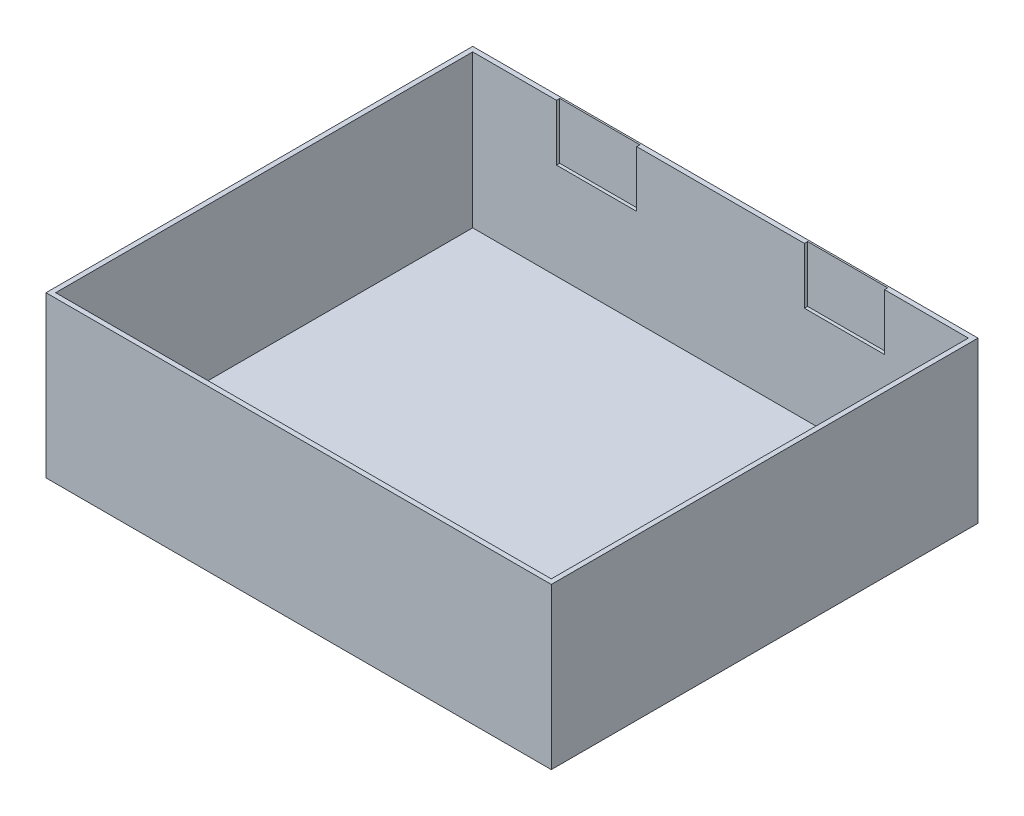
ISO-10303-21;
HEADER;
FILE_DESCRIPTION(('STEP AP214'),'2;1');
FILE_NAME('part.step','',(''),(''),'','','');
FILE_SCHEMA(('AUTOMOTIVE_DESIGN { 1 0 10303 214 1 1 1 1 }'));
ENDSEC;
DATA;
#1=APPLICATION_CONTEXT('core data for automotive mechanical design processes');
#2=APPLICATION_PROTOCOL_DEFINITION('international standard','automotive_design',2000,#1);
#3=PRODUCT_CONTEXT('',#1,'mechanical');
#4=PRODUCT('Part','Part','',(#3));
#5=PRODUCT_RELATED_PRODUCT_CATEGORY('part','',(#4));
#6=PRODUCT_DEFINITION_FORMATION('','',#4);
#7=PRODUCT_DEFINITION_CONTEXT('part definition',#1,'design');
#8=PRODUCT_DEFINITION('design','',#6,#7);
#9=PRODUCT_DEFINITION_SHAPE('','',#8);
#10=(LENGTH_UNIT() NAMED_UNIT(*) SI_UNIT(.MILLI.,.METRE.));
#11=(NAMED_UNIT(*) PLANE_ANGLE_UNIT() SI_UNIT($,.RADIAN.));
#12=(NAMED_UNIT(*) SI_UNIT($,.STERADIAN.) SOLID_ANGLE_UNIT());
#13=UNCERTAINTY_MEASURE_WITH_UNIT(LENGTH_MEASURE(1.E-05),#10,'distance_accuracy_value','');
#14=(GEOMETRIC_REPRESENTATION_CONTEXT(3) GLOBAL_UNCERTAINTY_ASSIGNED_CONTEXT((#13)) GLOBAL_UNIT_ASSIGNED_CONTEXT((#10,
#11,#12)) REPRESENTATION_CONTEXT('',''));
#15=CARTESIAN_POINT('',(0.,0.,0.));
#16=DIRECTION('',(0.,0.,1.));
#17=DIRECTION('',(1.,0.,0.));
#18=AXIS2_PLACEMENT_3D('',#15,#16,#17);
#19=CARTESIAN_POINT('',(0.,100.,0.));
#20=DIRECTION('',(0.,-1.,0.));
#21=DIRECTION('',(0.,0.,-1.));
#22=AXIS2_PLACEMENT_3D('',#19,#20,#21);
#23=PLANE('',#22);
#24=DIRECTION('',(0.,0.,-1.));
#25=VECTOR('',#24,1.);
#26=CARTESIAN_POINT('',(157.5,100.,133.));
#27=LINE('',#26,#25);
#28=CARTESIAN_POINT('',(157.5,100.,133.));
#29=VERTEX_POINT('',#28);
#30=CARTESIAN_POINT('',(157.5,100.,-133.));
#31=VERTEX_POINT('',#30);
#32=EDGE_CURVE('E232',#29,#31,#27,.T.);
#33=ORIENTED_EDGE('',*,*,#32,.T.);
#34=DIRECTION('',(-1.,0.,0.));
#35=VECTOR('',#34,1.);
#36=CARTESIAN_POINT('',(-157.5,100.,-133.));
#37=LINE('',#36,#35);
#38=CARTESIAN_POINT('',(-157.5,100.,-133.));
#39=VERTEX_POINT('',#38);
#40=EDGE_CURVE('E235',#31,#39,#37,.T.);
#41=ORIENTED_EDGE('',*,*,#40,.T.);
#42=DIRECTION('',(0.,0.,1.));
#43=VECTOR('',#42,1.);
#44=CARTESIAN_POINT('',(-157.5,100.,133.));
#45=LINE('',#44,#43);
#46=CARTESIAN_POINT('',(-157.5,100.,133.));
#47=VERTEX_POINT('',#46);
#48=EDGE_CURVE('E238',#39,#47,#45,.T.);
#49=ORIENTED_EDGE('',*,*,#48,.T.);
#50=DIRECTION('',(1.,0.,0.));
#51=VECTOR('',#50,1.);
#52=CARTESIAN_POINT('',(-157.5,100.,133.));
#53=LINE('',#52,#51);
#54=EDGE_CURVE('E240',#47,#29,#53,.T.);
#55=ORIENTED_EDGE('',*,*,#54,.T.);
#56=EDGE_LOOP('',(#33,#41,#49,#55));
#57=FACE_BOUND('',#56,.T.);
#58=DIRECTION('',(0.,0.,1.));
#59=VECTOR('',#58,1.);
#60=CARTESIAN_POINT('',(102.25,100.,-132.));
#61=LINE('',#60,#59);
#62=CARTESIAN_POINT('',(102.25,100.,-132.));
#63=VERTEX_POINT('',#62);
#64=CARTESIAN_POINT('',(102.25,100.,-130.));
#65=VERTEX_POINT('',#64);
#66=EDGE_CURVE('E153',#63,#65,#61,.T.);
#67=ORIENTED_EDGE('',*,*,#66,.T.);
#68=DIRECTION('',(-1.,0.,0.));
#69=VECTOR('',#68,1.);
#70=CARTESIAN_POINT('',(-154.5,100.,-130.));
#71=LINE('',#70,#69);
#72=CARTESIAN_POINT('',(154.5,100.,-130.));
#73=VERTEX_POINT('',#72);
#74=EDGE_CURVE('E222',#73,#65,#71,.T.);
#75=ORIENTED_EDGE('',*,*,#74,.F.);
#76=DIRECTION('',(0.,0.,-1.));
#77=VECTOR('',#76,1.);
#78=CARTESIAN_POINT('',(154.5,100.,-130.));
#79=LINE('',#78,#77);
#80=CARTESIAN_POINT('',(154.5,100.,130.));
#81=VERTEX_POINT('',#80);
#82=EDGE_CURVE('E212',#81,#73,#79,.T.);
#83=ORIENTED_EDGE('',*,*,#82,.F.);
#84=DIRECTION('',(1.,0.,0.));
#85=VECTOR('',#84,1.);
#86=CARTESIAN_POINT('',(-154.5,100.,130.));
#87=LINE('',#86,#85);
#88=CARTESIAN_POINT('',(-154.5,100.,130.));
#89=VERTEX_POINT('',#88);
#90=EDGE_CURVE('E228',#89,#81,#87,.T.);
#91=ORIENTED_EDGE('',*,*,#90,.F.);
#92=DIRECTION('',(0.,0.,1.));
#93=VECTOR('',#92,1.);
#94=CARTESIAN_POINT('',(-154.5,100.,-130.));
#95=LINE('',#94,#93);
#96=CARTESIAN_POINT('',(-154.5,100.,-130.));
#97=VERTEX_POINT('',#96);
#98=EDGE_CURVE('E224',#97,#89,#95,.T.);
#99=ORIENTED_EDGE('',*,*,#98,.F.);
#100=CARTESIAN_POINT('',(-102.25,100.,-130.));
#101=VERTEX_POINT('',#100);
#102=EDGE_CURVE('E221',#101,#97,#71,.T.);
#103=ORIENTED_EDGE('',*,*,#102,.F.);
#104=DIRECTION('',(0.,0.,1.));
#105=VECTOR('',#104,1.);
#106=CARTESIAN_POINT('',(-102.25,100.,-132.));
#107=LINE('',#106,#105);
#108=CARTESIAN_POINT('',(-102.25,100.,-132.));
#109=VERTEX_POINT('',#108);
#110=EDGE_CURVE('E210',#109,#101,#107,.T.);
#111=ORIENTED_EDGE('',*,*,#110,.F.);
#112=DIRECTION('',(-1.,0.,0.));
#113=VECTOR('',#112,1.);
#114=CARTESIAN_POINT('',(-102.25,100.,-132.));
#115=LINE('',#114,#113);
#116=CARTESIAN_POINT('',(-52.25,100.,-132.));
#117=VERTEX_POINT('',#116);
#118=EDGE_CURVE('E200',#117,#109,#115,.T.);
#119=ORIENTED_EDGE('',*,*,#118,.F.);
#120=DIRECTION('',(0.,0.,1.));
#121=VECTOR('',#120,1.);
#122=CARTESIAN_POINT('',(-52.25,100.,-132.));
#123=LINE('',#122,#121);
#124=CARTESIAN_POINT('',(-52.25,100.,-130.));
#125=VERTEX_POINT('',#124);
#126=EDGE_CURVE('E213',#117,#125,#123,.T.);
#127=ORIENTED_EDGE('',*,*,#126,.T.);
#128=CARTESIAN_POINT('',(52.25,100.,-130.));
#129=VERTEX_POINT('',#128);
#130=EDGE_CURVE('E225',#129,#125,#71,.T.);
#131=ORIENTED_EDGE('',*,*,#130,.F.);
#132=DIRECTION('',(0.,0.,1.));
#133=VECTOR('',#132,1.);
#134=CARTESIAN_POINT('',(52.25,100.,-132.));
#135=LINE('',#134,#133);
#136=CARTESIAN_POINT('',(52.25,100.,-132.));
#137=VERTEX_POINT('',#136);
#138=EDGE_CURVE('E54',#137,#129,#135,.T.);
#139=ORIENTED_EDGE('',*,*,#138,.F.);
#140=DIRECTION('',(1.,0.,0.));
#141=VECTOR('',#140,1.);
#142=CARTESIAN_POINT('',(102.25,100.,-132.));
#143=LINE('',#142,#141);
#144=EDGE_CURVE('E171',#137,#63,#143,.T.);
#145=ORIENTED_EDGE('',*,*,#144,.T.);
#146=EDGE_LOOP('',(#67,#75,#83,#91,#99,#103,#111,#119,#127,#131,#139,#145));
#147=FACE_BOUND('',#146,.T.);
#148=ADVANCED_FACE('F37',(#57,#147),#23,.F.);
#149=CARTESIAN_POINT('',(-157.5,100.,-130.));
#150=DIRECTION('',(0.,0.,1.));
#151=DIRECTION('',(1.,0.,0.));
#152=AXIS2_PLACEMENT_3D('',#149,#150,#151);
#153=PLANE('',#152);
#154=ORIENTED_EDGE('',*,*,#74,.T.);
#155=DIRECTION('',(0.,-1.,0.));
#156=VECTOR('',#155,1.);
#157=CARTESIAN_POINT('',(102.25,100.,-130.));
#158=LINE('',#157,#156);
#159=CARTESIAN_POINT('',(102.25,65.,-130.));
#160=VERTEX_POINT('',#159);
#161=EDGE_CURVE('E160',#65,#160,#158,.T.);
#162=ORIENTED_EDGE('',*,*,#161,.T.);
#163=DIRECTION('',(-1.,0.,0.));
#164=VECTOR('',#163,1.);
#165=CARTESIAN_POINT('',(102.25,65.,-130.));
#166=LINE('',#165,#164);
#167=CARTESIAN_POINT('',(52.25,65.,-130.));
#168=VERTEX_POINT('',#167);
#169=EDGE_CURVE('E172',#160,#168,#166,.T.);
#170=ORIENTED_EDGE('',*,*,#169,.T.);
#171=DIRECTION('',(0.,1.,0.));
#172=VECTOR('',#171,1.);
#173=CARTESIAN_POINT('',(52.25,100.,-130.));
#174=LINE('',#173,#172);
#175=EDGE_CURVE('E181',#168,#129,#174,.T.);
#176=ORIENTED_EDGE('',*,*,#175,.T.);
#177=ORIENTED_EDGE('',*,*,#130,.T.);
#178=DIRECTION('',(0.,1.,0.));
#179=VECTOR('',#178,1.);
#180=CARTESIAN_POINT('',(-52.25,100.,-130.));
#181=LINE('',#180,#179);
#182=CARTESIAN_POINT('',(-52.25,65.,-130.));
#183=VERTEX_POINT('',#182);
#184=EDGE_CURVE('E194',#183,#125,#181,.T.);
#185=ORIENTED_EDGE('',*,*,#184,.F.);
#186=DIRECTION('',(1.,0.,0.));
#187=VECTOR('',#186,1.);
#188=CARTESIAN_POINT('',(-102.25,65.,-130.));
#189=LINE('',#188,#187);
#190=CARTESIAN_POINT('',(-102.25,65.,-130.));
#191=VERTEX_POINT('',#190);
#192=EDGE_CURVE('E205',#191,#183,#189,.T.);
#193=ORIENTED_EDGE('',*,*,#192,.F.);
#194=DIRECTION('',(0.,-1.,0.));
#195=VECTOR('',#194,1.);
#196=CARTESIAN_POINT('',(-102.25,100.,-130.));
#197=LINE('',#196,#195);
#198=EDGE_CURVE('E62',#101,#191,#197,.T.);
#199=ORIENTED_EDGE('',*,*,#198,.F.);
#200=ORIENTED_EDGE('',*,*,#102,.T.);
#201=DIRECTION('',(0.,-1.,0.));
#202=VECTOR('',#201,1.);
#203=CARTESIAN_POINT('',(-154.5,100.,-130.));
#204=LINE('',#203,#202);
#205=CARTESIAN_POINT('',(-154.5,5.,-130.));
#206=VERTEX_POINT('',#205);
#207=EDGE_CURVE('E262',#97,#206,#204,.T.);
#208=ORIENTED_EDGE('',*,*,#207,.T.);
#209=DIRECTION('',(-1.,0.,0.));
#210=VECTOR('',#209,1.);
#211=CARTESIAN_POINT('',(0.,5.,-130.));
#212=LINE('',#211,#210);
#213=CARTESIAN_POINT('',(154.5,5.,-130.));
#214=VERTEX_POINT('',#213);
#215=EDGE_CURVE('E270',#214,#206,#212,.T.);
#216=ORIENTED_EDGE('',*,*,#215,.F.);
#217=DIRECTION('',(0.,-1.,0.));
#218=VECTOR('',#217,1.);
#219=CARTESIAN_POINT('',(154.5,100.,-130.));
#220=LINE('',#219,#218);
#221=EDGE_CURVE('E267',#73,#214,#220,.T.);
#222=ORIENTED_EDGE('',*,*,#221,.F.);
#223=EDGE_LOOP('',(#154,#162,#170,#176,#177,#185,#193,#199,#200,#208,#216,#222));
#224=FACE_BOUND('',#223,.T.);
#225=ADVANCED_FACE('F282',(#224),#153,.T.);
#226=CARTESIAN_POINT('',(157.5,100.,133.));
#227=DIRECTION('',(-1.,0.,0.));
#228=DIRECTION('',(0.,0.,1.));
#229=AXIS2_PLACEMENT_3D('',#226,#227,#228);
#230=PLANE('',#229);
#231=DIRECTION('',(0.,0.,-1.));
#232=VECTOR('',#231,1.);
#233=CARTESIAN_POINT('',(157.5,0.,133.));
#234=LINE('',#233,#232);
#235=CARTESIAN_POINT('',(157.5,0.,133.));
#236=VERTEX_POINT('',#235);
#237=CARTESIAN_POINT('',(157.5,0.,-133.));
#238=VERTEX_POINT('',#237);
#239=EDGE_CURVE('E231',#236,#238,#234,.T.);
#240=ORIENTED_EDGE('',*,*,#239,.T.);
#241=DIRECTION('',(0.,-1.,0.));
#242=VECTOR('',#241,1.);
#243=CARTESIAN_POINT('',(157.5,100.,-133.));
#244=LINE('',#243,#242);
#245=EDGE_CURVE('E258',#31,#238,#244,.T.);
#246=ORIENTED_EDGE('',*,*,#245,.F.);
#247=ORIENTED_EDGE('',*,*,#32,.F.);
#248=DIRECTION('',(0.,-1.,0.));
#249=VECTOR('',#248,1.);
#250=CARTESIAN_POINT('',(157.5,100.,133.));
#251=LINE('',#250,#249);
#252=EDGE_CURVE('E242',#29,#236,#251,.T.);
#253=ORIENTED_EDGE('',*,*,#252,.T.);
#254=EDGE_LOOP('',(#240,#246,#247,#253));
#255=FACE_BOUND('',#254,.T.);
#256=ADVANCED_FACE('F304',(#255),#230,.F.);
#257=CARTESIAN_POINT('',(-157.5,100.,-133.));
#258=DIRECTION('',(0.,0.,1.));
#259=DIRECTION('',(1.,0.,0.));
#260=AXIS2_PLACEMENT_3D('',#257,#258,#259);
#261=PLANE('',#260);
#262=DIRECTION('',(-1.,0.,0.));
#263=VECTOR('',#262,1.);
#264=CARTESIAN_POINT('',(-157.5,0.,-133.));
#265=LINE('',#264,#263);
#266=CARTESIAN_POINT('',(-157.5,0.,-133.));
#267=VERTEX_POINT('',#266);
#268=EDGE_CURVE('E245',#238,#267,#265,.T.);
#269=ORIENTED_EDGE('',*,*,#268,.T.);
#270=DIRECTION('',(0.,-1.,0.));
#271=VECTOR('',#270,1.);
#272=CARTESIAN_POINT('',(-157.5,100.,-133.));
#273=LINE('',#272,#271);
#274=EDGE_CURVE('E255',#39,#267,#273,.T.);
#275=ORIENTED_EDGE('',*,*,#274,.F.);
#276=ORIENTED_EDGE('',*,*,#40,.F.);
#277=ORIENTED_EDGE('',*,*,#245,.T.);
#278=EDGE_LOOP('',(#269,#275,#276,#277));
#279=FACE_BOUND('',#278,.T.);
#280=ADVANCED_FACE('F320',(#279),#261,.F.);
#281=CARTESIAN_POINT('',(-157.5,100.,133.));
#282=DIRECTION('',(1.,0.,0.));
#283=DIRECTION('',(0.,0.,-1.));
#284=AXIS2_PLACEMENT_3D('',#281,#282,#283);
#285=PLANE('',#284);
#286=DIRECTION('',(0.,0.,1.));
#287=VECTOR('',#286,1.);
#288=CARTESIAN_POINT('',(-157.5,0.,133.));
#289=LINE('',#288,#287);
#290=CARTESIAN_POINT('',(-157.5,0.,133.));
#291=VERTEX_POINT('',#290);
#292=EDGE_CURVE('E247',#267,#291,#289,.T.);
#293=ORIENTED_EDGE('',*,*,#292,.T.);
#294=DIRECTION('',(0.,-1.,0.));
#295=VECTOR('',#294,1.);
#296=CARTESIAN_POINT('',(-157.5,100.,133.));
#297=LINE('',#296,#295);
#298=EDGE_CURVE('E252',#47,#291,#297,.T.);
#299=ORIENTED_EDGE('',*,*,#298,.F.);
#300=ORIENTED_EDGE('',*,*,#48,.F.);
#301=ORIENTED_EDGE('',*,*,#274,.T.);
#302=EDGE_LOOP('',(#293,#299,#300,#301));
#303=FACE_BOUND('',#302,.T.);
#304=ADVANCED_FACE('F316',(#303),#285,.F.);
#305=CARTESIAN_POINT('',(-157.5,100.,133.));
#306=DIRECTION('',(0.,0.,-1.));
#307=DIRECTION('',(-1.,0.,0.));
#308=AXIS2_PLACEMENT_3D('',#305,#306,#307);
#309=PLANE('',#308);
#310=DIRECTION('',(1.,0.,0.));
#311=VECTOR('',#310,1.);
#312=CARTESIAN_POINT('',(-157.5,0.,133.));
#313=LINE('',#312,#311);
#314=EDGE_CURVE('E236',#291,#236,#313,.T.);
#315=ORIENTED_EDGE('',*,*,#314,.T.);
#316=ORIENTED_EDGE('',*,*,#252,.F.);
#317=ORIENTED_EDGE('',*,*,#54,.F.);
#318=ORIENTED_EDGE('',*,*,#298,.T.);
#319=EDGE_LOOP('',(#315,#316,#317,#318));
#320=FACE_BOUND('',#319,.T.);
#321=ADVANCED_FACE('F312',(#320),#309,.F.);
#322=CARTESIAN_POINT('',(0.,0.,0.));
#323=DIRECTION('',(0.,-1.,0.));
#324=DIRECTION('',(0.,0.,-1.));
#325=AXIS2_PLACEMENT_3D('',#322,#323,#324);
#326=PLANE('',#325);
#327=ORIENTED_EDGE('',*,*,#239,.F.);
#328=ORIENTED_EDGE('',*,*,#314,.F.);
#329=ORIENTED_EDGE('',*,*,#292,.F.);
#330=ORIENTED_EDGE('',*,*,#268,.F.);
#331=EDGE_LOOP('',(#327,#328,#329,#330));
#332=FACE_BOUND('',#331,.T.);
#333=ADVANCED_FACE('F309',(#332),#326,.T.);
#334=CARTESIAN_POINT('',(154.5,100.,133.));
#335=DIRECTION('',(-1.,0.,0.));
#336=DIRECTION('',(0.,0.,1.));
#337=AXIS2_PLACEMENT_3D('',#334,#335,#336);
#338=PLANE('',#337);
#339=DIRECTION('',(0.,0.,-1.));
#340=VECTOR('',#339,1.);
#341=CARTESIAN_POINT('',(154.5,5.,0.));
#342=LINE('',#341,#340);
#343=CARTESIAN_POINT('',(154.5,5.,130.));
#344=VERTEX_POINT('',#343);
#345=EDGE_CURVE('E41',#344,#214,#342,.T.);
#346=ORIENTED_EDGE('',*,*,#345,.F.);
#347=DIRECTION('',(0.,-1.,0.));
#348=VECTOR('',#347,1.);
#349=CARTESIAN_POINT('',(154.5,100.,130.));
#350=LINE('',#349,#348);
#351=EDGE_CURVE('E271',#81,#344,#350,.T.);
#352=ORIENTED_EDGE('',*,*,#351,.F.);
#353=ORIENTED_EDGE('',*,*,#82,.T.);
#354=ORIENTED_EDGE('',*,*,#221,.T.);
#355=EDGE_LOOP('',(#346,#352,#353,#354));
#356=FACE_BOUND('',#355,.T.);
#357=ADVANCED_FACE('F279',(#356),#338,.T.);
#358=CARTESIAN_POINT('',(-154.5,100.,133.));
#359=DIRECTION('',(1.,0.,0.));
#360=DIRECTION('',(0.,0.,-1.));
#361=AXIS2_PLACEMENT_3D('',#358,#359,#360);
#362=PLANE('',#361);
#363=DIRECTION('',(0.,0.,1.));
#364=VECTOR('',#363,1.);
#365=CARTESIAN_POINT('',(-154.5,5.,0.));
#366=LINE('',#365,#364);
#367=CARTESIAN_POINT('',(-154.5,5.,130.));
#368=VERTEX_POINT('',#367);
#369=EDGE_CURVE('E265',#206,#368,#366,.T.);
#370=ORIENTED_EDGE('',*,*,#369,.F.);
#371=ORIENTED_EDGE('',*,*,#207,.F.);
#372=ORIENTED_EDGE('',*,*,#98,.T.);
#373=DIRECTION('',(0.,-1.,0.));
#374=VECTOR('',#373,1.);
#375=CARTESIAN_POINT('',(-154.5,100.,130.));
#376=LINE('',#375,#374);
#377=EDGE_CURVE('E11',#89,#368,#376,.T.);
#378=ORIENTED_EDGE('',*,*,#377,.T.);
#379=EDGE_LOOP('',(#370,#371,#372,#378));
#380=FACE_BOUND('',#379,.T.);
#381=ADVANCED_FACE('F288',(#380),#362,.T.);
#382=CARTESIAN_POINT('',(-157.5,100.,130.));
#383=DIRECTION('',(0.,0.,-1.));
#384=DIRECTION('',(-1.,0.,0.));
#385=AXIS2_PLACEMENT_3D('',#382,#383,#384);
#386=PLANE('',#385);
#387=DIRECTION('',(1.,0.,0.));
#388=VECTOR('',#387,1.);
#389=CARTESIAN_POINT('',(0.,5.,130.));
#390=LINE('',#389,#388);
#391=EDGE_CURVE('E46',#368,#344,#390,.T.);
#392=ORIENTED_EDGE('',*,*,#391,.F.);
#393=ORIENTED_EDGE('',*,*,#377,.F.);
#394=ORIENTED_EDGE('',*,*,#90,.T.);
#395=ORIENTED_EDGE('',*,*,#351,.T.);
#396=EDGE_LOOP('',(#392,#393,#394,#395));
#397=FACE_BOUND('',#396,.T.);
#398=ADVANCED_FACE('F290',(#397),#386,.T.);
#399=CARTESIAN_POINT('',(0.,5.,0.));
#400=DIRECTION('',(0.,-1.,0.));
#401=DIRECTION('',(0.,0.,-1.));
#402=AXIS2_PLACEMENT_3D('',#399,#400,#401);
#403=PLANE('',#402);
#404=ORIENTED_EDGE('',*,*,#345,.T.);
#405=ORIENTED_EDGE('',*,*,#215,.T.);
#406=ORIENTED_EDGE('',*,*,#369,.T.);
#407=ORIENTED_EDGE('',*,*,#391,.T.);
#408=EDGE_LOOP('',(#404,#405,#406,#407));
#409=FACE_BOUND('',#408,.T.);
#410=ADVANCED_FACE('F39',(#409),#403,.F.);
#411=CARTESIAN_POINT('',(-102.25,100.,-132.));
#412=DIRECTION('',(-1.,0.,0.));
#413=DIRECTION('',(0.,0.,1.));
#414=AXIS2_PLACEMENT_3D('',#411,#412,#413);
#415=PLANE('',#414);
#416=ORIENTED_EDGE('',*,*,#198,.T.);
#417=DIRECTION('',(0.,0.,1.));
#418=VECTOR('',#417,1.);
#419=CARTESIAN_POINT('',(-102.25,65.,-132.));
#420=LINE('',#419,#418);
#421=CARTESIAN_POINT('',(-102.25,65.,-132.));
#422=VERTEX_POINT('',#421);
#423=EDGE_CURVE('E203',#422,#191,#420,.T.);
#424=ORIENTED_EDGE('',*,*,#423,.F.);
#425=DIRECTION('',(0.,-1.,0.));
#426=VECTOR('',#425,1.);
#427=CARTESIAN_POINT('',(-102.25,100.,-132.));
#428=LINE('',#427,#426);
#429=EDGE_CURVE('E190',#109,#422,#428,.T.);
#430=ORIENTED_EDGE('',*,*,#429,.F.);
#431=ORIENTED_EDGE('',*,*,#110,.T.);
#432=EDGE_LOOP('',(#416,#424,#430,#431));
#433=FACE_BOUND('',#432,.T.);
#434=ADVANCED_FACE('F296',(#433),#415,.F.);
#435=CARTESIAN_POINT('',(-52.25,100.,-132.));
#436=DIRECTION('',(1.,0.,0.));
#437=DIRECTION('',(0.,1.,0.));
#438=AXIS2_PLACEMENT_3D('',#435,#436,#437);
#439=PLANE('',#438);
#440=ORIENTED_EDGE('',*,*,#184,.T.);
#441=ORIENTED_EDGE('',*,*,#126,.F.);
#442=DIRECTION('',(0.,1.,0.));
#443=VECTOR('',#442,1.);
#444=CARTESIAN_POINT('',(-52.25,100.,-132.));
#445=LINE('',#444,#443);
#446=CARTESIAN_POINT('',(-52.25,65.,-132.));
#447=VERTEX_POINT('',#446);
#448=EDGE_CURVE('E197',#447,#117,#445,.T.);
#449=ORIENTED_EDGE('',*,*,#448,.F.);
#450=DIRECTION('',(0.,0.,1.));
#451=VECTOR('',#450,1.);
#452=CARTESIAN_POINT('',(-52.25,65.,-132.));
#453=LINE('',#452,#451);
#454=EDGE_CURVE('E216',#447,#183,#453,.T.);
#455=ORIENTED_EDGE('',*,*,#454,.T.);
#456=EDGE_LOOP('',(#440,#441,#449,#455));
#457=FACE_BOUND('',#456,.T.);
#458=ADVANCED_FACE('F353',(#457),#439,.F.);
#459=CARTESIAN_POINT('',(-102.25,65.,-132.));
#460=DIRECTION('',(0.,-1.,0.));
#461=DIRECTION('',(1.,0.,0.));
#462=AXIS2_PLACEMENT_3D('',#459,#460,#461);
#463=PLANE('',#462);
#464=ORIENTED_EDGE('',*,*,#192,.T.);
#465=ORIENTED_EDGE('',*,*,#454,.F.);
#466=DIRECTION('',(1.,0.,0.));
#467=VECTOR('',#466,1.);
#468=CARTESIAN_POINT('',(-102.25,65.,-132.));
#469=LINE('',#468,#467);
#470=EDGE_CURVE('E193',#422,#447,#469,.T.);
#471=ORIENTED_EDGE('',*,*,#470,.F.);
#472=ORIENTED_EDGE('',*,*,#423,.T.);
#473=EDGE_LOOP('',(#464,#465,#471,#472));
#474=FACE_BOUND('',#473,.T.);
#475=ADVANCED_FACE('F361',(#474),#463,.F.);
#476=CARTESIAN_POINT('',(0.,0.,-132.));
#477=DIRECTION('',(0.,0.,1.));
#478=DIRECTION('',(1.,0.,0.));
#479=AXIS2_PLACEMENT_3D('',#476,#477,#478);
#480=PLANE('',#479);
#481=ORIENTED_EDGE('',*,*,#429,.T.);
#482=ORIENTED_EDGE('',*,*,#470,.T.);
#483=ORIENTED_EDGE('',*,*,#448,.T.);
#484=ORIENTED_EDGE('',*,*,#118,.T.);
#485=EDGE_LOOP('',(#481,#482,#483,#484));
#486=FACE_BOUND('',#485,.T.);
#487=ADVANCED_FACE('F371',(#486),#480,.T.);
#488=CARTESIAN_POINT('',(102.25,100.,-132.));
#489=DIRECTION('',(-1.,0.,0.));
#490=DIRECTION('',(0.,0.,1.));
#491=AXIS2_PLACEMENT_3D('',#488,#489,#490);
#492=PLANE('',#491);
#493=ORIENTED_EDGE('',*,*,#161,.F.);
#494=ORIENTED_EDGE('',*,*,#66,.F.);
#495=DIRECTION('',(0.,-1.,0.));
#496=VECTOR('',#495,1.);
#497=CARTESIAN_POINT('',(102.25,100.,-132.));
#498=LINE('',#497,#496);
#499=CARTESIAN_POINT('',(102.25,65.,-132.));
#500=VERTEX_POINT('',#499);
#501=EDGE_CURVE('E157',#63,#500,#498,.T.);
#502=ORIENTED_EDGE('',*,*,#501,.T.);
#503=DIRECTION('',(0.,0.,1.));
#504=VECTOR('',#503,1.);
#505=CARTESIAN_POINT('',(102.25,65.,-132.));
#506=LINE('',#505,#504);
#507=EDGE_CURVE('E185',#500,#160,#506,.T.);
#508=ORIENTED_EDGE('',*,*,#507,.T.);
#509=EDGE_LOOP('',(#493,#494,#502,#508));
#510=FACE_BOUND('',#509,.T.);
#511=ADVANCED_FACE('F155',(#510),#492,.T.);
#512=CARTESIAN_POINT('',(102.25,65.,-132.));
#513=DIRECTION('',(0.,1.,0.));
#514=DIRECTION('',(-1.,0.,0.));
#515=AXIS2_PLACEMENT_3D('',#512,#513,#514);
#516=PLANE('',#515);
#517=ORIENTED_EDGE('',*,*,#169,.F.);
#518=ORIENTED_EDGE('',*,*,#507,.F.);
#519=DIRECTION('',(-1.,0.,0.));
#520=VECTOR('',#519,1.);
#521=CARTESIAN_POINT('',(102.25,65.,-132.));
#522=LINE('',#521,#520);
#523=CARTESIAN_POINT('',(52.25,65.,-132.));
#524=VERTEX_POINT('',#523);
#525=EDGE_CURVE('E165',#500,#524,#522,.T.);
#526=ORIENTED_EDGE('',*,*,#525,.T.);
#527=DIRECTION('',(0.,0.,1.));
#528=VECTOR('',#527,1.);
#529=CARTESIAN_POINT('',(52.25,65.,-132.));
#530=LINE('',#529,#528);
#531=EDGE_CURVE('E187',#524,#168,#530,.T.);
#532=ORIENTED_EDGE('',*,*,#531,.T.);
#533=EDGE_LOOP('',(#517,#518,#526,#532));
#534=FACE_BOUND('',#533,.T.);
#535=ADVANCED_FACE('F400',(#534),#516,.T.);
#536=CARTESIAN_POINT('',(52.25,100.,-132.));
#537=DIRECTION('',(1.,0.,0.));
#538=DIRECTION('',(0.,1.,0.));
#539=AXIS2_PLACEMENT_3D('',#536,#537,#538);
#540=PLANE('',#539);
#541=ORIENTED_EDGE('',*,*,#175,.F.);
#542=ORIENTED_EDGE('',*,*,#531,.F.);
#543=DIRECTION('',(0.,1.,0.));
#544=VECTOR('',#543,1.);
#545=CARTESIAN_POINT('',(52.25,100.,-132.));
#546=LINE('',#545,#544);
#547=EDGE_CURVE('E175',#524,#137,#546,.T.);
#548=ORIENTED_EDGE('',*,*,#547,.T.);
#549=ORIENTED_EDGE('',*,*,#138,.T.);
#550=EDGE_LOOP('',(#541,#542,#548,#549));
#551=FACE_BOUND('',#550,.T.);
#552=ADVANCED_FACE('F409',(#551),#540,.T.);
#553=CARTESIAN_POINT('',(0.,0.,-132.));
#554=DIRECTION('',(0.,0.,1.));
#555=DIRECTION('',(-1.,0.,0.));
#556=AXIS2_PLACEMENT_3D('',#553,#554,#555);
#557=PLANE('',#556);
#558=ORIENTED_EDGE('',*,*,#501,.F.);
#559=ORIENTED_EDGE('',*,*,#144,.F.);
#560=ORIENTED_EDGE('',*,*,#547,.F.);
#561=ORIENTED_EDGE('',*,*,#525,.F.);
#562=EDGE_LOOP('',(#558,#559,#560,#561));
#563=FACE_BOUND('',#562,.T.);
#564=ADVANCED_FACE('F169',(#563),#557,.T.);
#565=CLOSED_SHELL('',(#148,#225,#256,#280,#304,#321,#333,#357,#381,#398,#410,#434,#458,#475,
#487,#511,#535,#552,#564));
#566=MANIFOLD_SOLID_BREP('B2',#565);
#567=ADVANCED_BREP_SHAPE_REPRESENTATION('',(#18,#566),#14);
#568=SHAPE_DEFINITION_REPRESENTATION(#9,#567);
ENDSEC;
END-ISO-10303-21;
